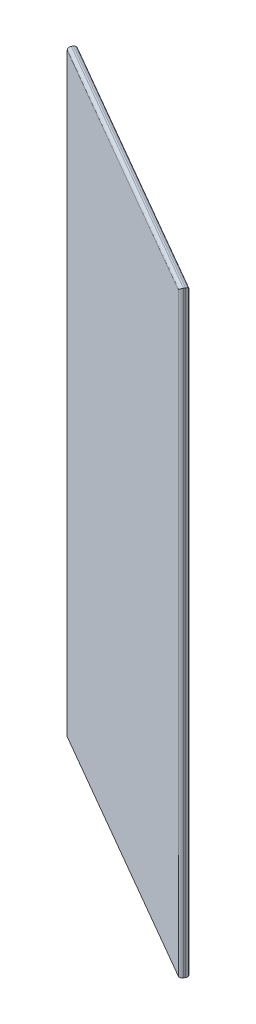
ISO-10303-21;
HEADER;
FILE_DESCRIPTION(('STEP AP214'),'2;1');
FILE_NAME('part.step','',(''),(''),'','','');
FILE_SCHEMA(('AUTOMOTIVE_DESIGN { 1 0 10303 214 1 1 1 1 }'));
ENDSEC;
DATA;
#1=APPLICATION_CONTEXT('core data for automotive mechanical design processes');
#2=APPLICATION_PROTOCOL_DEFINITION('international standard','automotive_design',2000,#1);
#3=PRODUCT_CONTEXT('',#1,'mechanical');
#4=PRODUCT('Part','Part','',(#3));
#5=PRODUCT_RELATED_PRODUCT_CATEGORY('part','',(#4));
#6=PRODUCT_DEFINITION_FORMATION('','',#4);
#7=PRODUCT_DEFINITION_CONTEXT('part definition',#1,'design');
#8=PRODUCT_DEFINITION('design','',#6,#7);
#9=PRODUCT_DEFINITION_SHAPE('','',#8);
#10=(LENGTH_UNIT() NAMED_UNIT(*) SI_UNIT(.MILLI.,.METRE.));
#11=(NAMED_UNIT(*) PLANE_ANGLE_UNIT() SI_UNIT($,.RADIAN.));
#12=(NAMED_UNIT(*) SI_UNIT($,.STERADIAN.) SOLID_ANGLE_UNIT());
#13=UNCERTAINTY_MEASURE_WITH_UNIT(LENGTH_MEASURE(1.E-05),#10,'distance_accuracy_value','');
#14=(GEOMETRIC_REPRESENTATION_CONTEXT(3) GLOBAL_UNCERTAINTY_ASSIGNED_CONTEXT((#13)) GLOBAL_UNIT_ASSIGNED_CONTEXT((#10,
#11,#12)) REPRESENTATION_CONTEXT('',''));
#15=CARTESIAN_POINT('',(0.,0.,0.));
#16=DIRECTION('',(0.,0.,1.));
#17=DIRECTION('',(1.,0.,0.));
#18=AXIS2_PLACEMENT_3D('',#15,#16,#17);
#19=CARTESIAN_POINT('',(416.587352604538,-130.530222179374,-111.500239054493));
#20=DIRECTION('',(-0.500000000000004,0.,0.866025403784437));
#21=DIRECTION('',(0.,1.,0.));
#22=AXIS2_PLACEMENT_3D('',#19,#20,#21);
#23=PLANE('',#22);
#24=DIRECTION('',(0.,1.,0.));
#25=VECTOR('',#24,1.);
#26=CARTESIAN_POINT('',(412.543041450155,-130.530222179374,-113.835223188163));
#27=LINE('',#26,#25);
#28=CARTESIAN_POINT('',(412.543041450155,75.0000000000001,-113.835223188163));
#29=VERTEX_POINT('',#28);
#30=CARTESIAN_POINT('',(412.543041450155,468.,-113.835223188163));
#31=VERTEX_POINT('',#30);
#32=EDGE_CURVE('E140',#29,#31,#27,.T.);
#33=ORIENTED_EDGE('',*,*,#32,.T.);
#34=DIRECTION('',(0.866025403784437,0.,0.500000000000004));
#35=VECTOR('',#34,1.);
#36=CARTESIAN_POINT('',(416.587352604538,468.,-111.500239054493));
#37=LINE('',#36,#35);
#38=CARTESIAN_POINT('',(238.645636945092,468.,-214.234936490539));
#39=VERTEX_POINT('',#38);
#40=EDGE_CURVE('E142',#31,#39,#37,.F.);
#41=ORIENTED_EDGE('',*,*,#40,.T.);
#42=DIRECTION('',(0.,1.,0.));
#43=VECTOR('',#42,1.);
#44=CARTESIAN_POINT('',(238.645636945092,-130.530222179374,-214.234936490539));
#45=LINE('',#44,#43);
#46=CARTESIAN_POINT('',(238.645636945092,75.,-214.234936490539));
#47=VERTEX_POINT('',#46);
#48=EDGE_CURVE('E115',#47,#39,#45,.T.);
#49=ORIENTED_EDGE('',*,*,#48,.F.);
#50=DIRECTION('',(-0.866025403784437,0.,-0.500000000000004));
#51=VECTOR('',#50,1.);
#52=CARTESIAN_POINT('',(416.587352604538,75.0000000000001,-111.500239054493));
#53=LINE('',#52,#51);
#54=EDGE_CURVE('E107',#29,#47,#53,.T.);
#55=ORIENTED_EDGE('',*,*,#54,.F.);
#56=EDGE_LOOP('',(#33,#41,#49,#55));
#57=FACE_BOUND('',#56,.T.);
#58=ADVANCED_FACE('F38',(#57),#23,.T.);
#59=CARTESIAN_POINT('',(419.087352604538,-130.530222179374,-115.830366073415));
#60=DIRECTION('',(0.500000000000004,0.,-0.866025403784437));
#61=DIRECTION('',(0.,-1.,0.));
#62=AXIS2_PLACEMENT_3D('',#59,#60,#61);
#63=PLANE('',#62);
#64=DIRECTION('',(0.,1.,0.));
#65=VECTOR('',#64,1.);
#66=CARTESIAN_POINT('',(241.145636945092,-130.530222179374,-218.565063509461));
#67=LINE('',#66,#65);
#68=CARTESIAN_POINT('',(241.145636945092,75.,-218.565063509461));
#69=VERTEX_POINT('',#68);
#70=CARTESIAN_POINT('',(241.145636945092,468.,-218.565063509461));
#71=VERTEX_POINT('',#70);
#72=EDGE_CURVE('E114',#69,#71,#67,.T.);
#73=ORIENTED_EDGE('',*,*,#72,.T.);
#74=DIRECTION('',(-0.866025403784437,0.,-0.500000000000004));
#75=VECTOR('',#74,1.);
#76=CARTESIAN_POINT('',(419.087352604538,468.,-115.830366073415));
#77=LINE('',#76,#75);
#78=CARTESIAN_POINT('',(415.043041450155,468.,-118.165350207085));
#79=VERTEX_POINT('',#78);
#80=EDGE_CURVE('E11',#71,#79,#77,.F.);
#81=ORIENTED_EDGE('',*,*,#80,.T.);
#82=DIRECTION('',(0.,1.,0.));
#83=VECTOR('',#82,1.);
#84=CARTESIAN_POINT('',(415.043041450155,-130.530222179374,-118.165350207085));
#85=LINE('',#84,#83);
#86=CARTESIAN_POINT('',(415.043041450155,75.0000000000001,-118.165350207085));
#87=VERTEX_POINT('',#86);
#88=EDGE_CURVE('E47',#79,#87,#85,.F.);
#89=ORIENTED_EDGE('',*,*,#88,.T.);
#90=DIRECTION('',(0.866025403784437,0.,0.500000000000004));
#91=VECTOR('',#90,1.);
#92=CARTESIAN_POINT('',(419.087352604538,75.0000000000001,-115.830366073415));
#93=LINE('',#92,#91);
#94=EDGE_CURVE('E104',#69,#87,#93,.T.);
#95=ORIENTED_EDGE('',*,*,#94,.F.);
#96=EDGE_LOOP('',(#73,#81,#89,#95));
#97=FACE_BOUND('',#96,.T.);
#98=ADVANCED_FACE('F113',(#97),#63,.T.);
#99=CARTESIAN_POINT('',(142.644284148503,470.,-532.355715851499));
#100=DIRECTION('',(0.,1.,0.));
#101=DIRECTION('',(-0.866025403784436,0.,-0.500000000000004));
#102=AXIS2_PLACEMENT_3D('',#99,#100,#101);
#103=PLANE('',#102);
#104=DIRECTION('',(-0.500000000000004,0.,0.866025403784436));
#105=VECTOR('',#104,1.);
#106=CARTESIAN_POINT('',(241.145636945092,470.,-218.565063509461));
#107=LINE('',#106,#105);
#108=CARTESIAN_POINT('',(240.145636945092,470.,-216.833012701892));
#109=VERTEX_POINT('',#108);
#110=CARTESIAN_POINT('',(239.645636945092,470.,-215.966987298108));
#111=VERTEX_POINT('',#110);
#112=EDGE_CURVE('E120',#109,#111,#107,.T.);
#113=ORIENTED_EDGE('',*,*,#112,.T.);
#114=DIRECTION('',(0.866025403784437,0.,0.500000000000004));
#115=VECTOR('',#114,1.);
#116=CARTESIAN_POINT('',(29.8942841485017,470.,-337.066987298109));
#117=LINE('',#116,#115);
#118=CARTESIAN_POINT('',(415.275096772052,470.,-114.567271389383));
#119=VERTEX_POINT('',#118);
#120=EDGE_CURVE('E133',#111,#119,#117,.T.);
#121=ORIENTED_EDGE('',*,*,#120,.T.);
#122=CARTESIAN_POINT('',(225.,470.,-225.));
#123=DIRECTION('',(0.,1.,0.));
#124=DIRECTION('',(0.500000000000004,0.,-0.866025403784436));
#125=AXIS2_PLACEMENT_3D('',#122,#123,#124);
#126=CIRCLE('',#125,220.);
#127=CARTESIAN_POINT('',(415.775096772052,470.,-115.433296793167));
#128=VERTEX_POINT('',#127);
#129=EDGE_CURVE('E158',#119,#128,#126,.T.);
#130=ORIENTED_EDGE('',*,*,#129,.T.);
#131=DIRECTION('',(-0.866025403784437,0.,-0.500000000000004));
#132=VECTOR('',#131,1.);
#133=CARTESIAN_POINT('',(30.3942841485018,470.,-337.933012701893));
#134=LINE('',#133,#132);
#135=EDGE_CURVE('E130',#128,#109,#134,.T.);
#136=ORIENTED_EDGE('',*,*,#135,.T.);
#137=EDGE_LOOP('',(#113,#121,#130,#136));
#138=FACE_BOUND('',#137,.T.);
#139=ADVANCED_FACE('F182',(#138),#103,.T.);
#140=CARTESIAN_POINT('',(225.,75.,-225.));
#141=DIRECTION('',(0.,1.,0.));
#142=DIRECTION('',(0.500000000000004,0.,-0.866025403784436));
#143=AXIS2_PLACEMENT_3D('',#140,#141,#142);
#144=PLANE('',#143);
#145=CARTESIAN_POINT('',(225.,75.,-225.));
#146=DIRECTION('',(0.,1.,0.));
#147=DIRECTION('',(0.500000000000004,0.,-0.866025403784436));
#148=AXIS2_PLACEMENT_3D('',#145,#146,#147);
#149=CIRCLE('',#148,220.);
#150=CARTESIAN_POINT('',(415.272794124009,75.0000000000001,-114.56330403239));
#151=VERTEX_POINT('',#150);
#152=CARTESIAN_POINT('',(415.777381279973,75.0000000000001,-115.437274623365));
#153=VERTEX_POINT('',#152);
#154=EDGE_CURVE('E127',#151,#153,#149,.T.);
#155=ORIENTED_EDGE('',*,*,#154,.F.);
#156=CARTESIAN_POINT('',(413.543041450155,75.0000000000001,-115.567273995732));
#157=DIRECTION('',(0.,1.,0.));
#158=DIRECTION('',(0.500000000000004,0.,-0.866025403784436));
#159=AXIS2_PLACEMENT_3D('',#156,#157,#158);
#160=CIRCLE('',#159,2.);
#161=EDGE_CURVE('E149',#151,#29,#160,.F.);
#162=ORIENTED_EDGE('',*,*,#161,.T.);
#163=ORIENTED_EDGE('',*,*,#54,.T.);
#164=DIRECTION('',(0.500000000000004,0.,-0.866025403784436));
#165=VECTOR('',#164,1.);
#166=CARTESIAN_POINT('',(241.145636945092,75.,-218.565063509461));
#167=LINE('',#166,#165);
#168=EDGE_CURVE('E101',#47,#69,#167,.T.);
#169=ORIENTED_EDGE('',*,*,#168,.T.);
#170=ORIENTED_EDGE('',*,*,#94,.T.);
#171=CARTESIAN_POINT('',(414.043041450155,75.0000000000001,-116.433299399516));
#172=DIRECTION('',(0.,1.,0.));
#173=DIRECTION('',(0.500000000000004,0.,-0.866025403784436));
#174=AXIS2_PLACEMENT_3D('',#171,#172,#173);
#175=CIRCLE('',#174,2.);
#176=EDGE_CURVE('E147',#87,#153,#175,.F.);
#177=ORIENTED_EDGE('',*,*,#176,.T.);
#178=EDGE_LOOP('',(#155,#162,#163,#169,#170,#177));
#179=FACE_BOUND('',#178,.T.);
#180=ADVANCED_FACE('F103',(#179),#144,.F.);
#181=CARTESIAN_POINT('',(241.145636945092,-130.530222179374,-218.565063509461));
#182=DIRECTION('',(-0.866025403784436,0.,-0.500000000000004));
#183=DIRECTION('',(0.,-1.,0.));
#184=AXIS2_PLACEMENT_3D('',#181,#182,#183);
#185=PLANE('',#184);
#186=ORIENTED_EDGE('',*,*,#48,.T.);
#187=CARTESIAN_POINT('',(239.645636945092,468.,-215.966987298108));
#188=DIRECTION('',(-0.866025403784436,0.,-0.500000000000004));
#189=DIRECTION('',(0.,-1.,0.));
#190=AXIS2_PLACEMENT_3D('',#187,#188,#189);
#191=CIRCLE('',#190,2.);
#192=EDGE_CURVE('E145',#39,#111,#191,.T.);
#193=ORIENTED_EDGE('',*,*,#192,.T.);
#194=ORIENTED_EDGE('',*,*,#112,.F.);
#195=CARTESIAN_POINT('',(240.145636945092,468.,-216.833012701892));
#196=DIRECTION('',(-0.866025403784436,0.,-0.500000000000004));
#197=DIRECTION('',(0.,-1.,0.));
#198=AXIS2_PLACEMENT_3D('',#195,#196,#197);
#199=CIRCLE('',#198,2.);
#200=EDGE_CURVE('E119',#109,#71,#199,.T.);
#201=ORIENTED_EDGE('',*,*,#200,.T.);
#202=ORIENTED_EDGE('',*,*,#72,.F.);
#203=ORIENTED_EDGE('',*,*,#168,.F.);
#204=EDGE_LOOP('',(#186,#193,#194,#201,#202,#203));
#205=FACE_BOUND('',#204,.T.);
#206=ADVANCED_FACE('F117',(#205),#185,.T.);
#207=CARTESIAN_POINT('',(225.,-606.32717805851,-225.));
#208=DIRECTION('',(0.,1.,0.));
#209=DIRECTION('',(0.500000000000004,0.,-0.866025403784436));
#210=AXIS2_PLACEMENT_3D('',#207,#208,#209);
#211=CYLINDRICAL_SURFACE('',#210,220.);
#212=CARTESIAN_POINT('',(415.272794124009,470.,-114.56330403239));
#213=VERTEX_POINT('',#212);
#214=EDGE_CURVE('E124',#213,#119,#126,.T.);
#215=ORIENTED_EDGE('',*,*,#214,.F.);
#216=DIRECTION('',(0.,1.,0.));
#217=VECTOR('',#216,1.);
#218=CARTESIAN_POINT('',(415.272794124009,-606.327178058509,-114.56330403239));
#219=LINE('',#218,#217);
#220=EDGE_CURVE('E138',#213,#151,#219,.F.);
#221=ORIENTED_EDGE('',*,*,#220,.T.);
#222=ORIENTED_EDGE('',*,*,#154,.T.);
#223=DIRECTION('',(0.,1.,0.));
#224=VECTOR('',#223,1.);
#225=CARTESIAN_POINT('',(415.777381279973,-606.327178058509,-115.437274623365));
#226=LINE('',#225,#224);
#227=CARTESIAN_POINT('',(415.777381279973,470.,-115.437274623365));
#228=VERTEX_POINT('',#227);
#229=EDGE_CURVE('E136',#153,#228,#226,.T.);
#230=ORIENTED_EDGE('',*,*,#229,.T.);
#231=EDGE_CURVE('E153',#128,#228,#126,.T.);
#232=ORIENTED_EDGE('',*,*,#231,.F.);
#233=ORIENTED_EDGE('',*,*,#129,.F.);
#234=EDGE_LOOP('',(#215,#221,#222,#230,#232,#233));
#235=FACE_BOUND('',#234,.T.);
#236=ADVANCED_FACE('F169',(#235),#211,.T.);
#237=CARTESIAN_POINT('',(413.543041450155,-606.327178058509,-115.567273995731));
#238=DIRECTION('',(0.,1.,0.));
#239=DIRECTION('',(0.500000000000004,0.,-0.866025403784436));
#240=AXIS2_PLACEMENT_3D('',#237,#238,#239);
#241=CYLINDRICAL_SURFACE('',#240,2.);
#242=ORIENTED_EDGE('',*,*,#161,.F.);
#243=ORIENTED_EDGE('',*,*,#220,.F.);
#244=CARTESIAN_POINT('',(413.543041450155,468.,-115.567273995732));
#245=DIRECTION('',(-0.612372435695793,0.707106781186547,-0.353553390593277));
#246=DIRECTION('',(0.612372435695793,0.707106781186548,0.353553390593276));
#247=AXIS2_PLACEMENT_3D('',#244,#245,#246);
#248=ELLIPSE('',#247,2.82842712474619,2.);
#249=EDGE_CURVE('E151',#31,#213,#248,.T.);
#250=ORIENTED_EDGE('',*,*,#249,.F.);
#251=ORIENTED_EDGE('',*,*,#32,.F.);
#252=EDGE_LOOP('',(#242,#243,#250,#251));
#253=FACE_BOUND('',#252,.T.);
#254=ADVANCED_FACE('F173',(#253),#241,.T.);
#255=CARTESIAN_POINT('',(29.8942841485017,468.,-337.066987298109));
#256=DIRECTION('',(0.866025403784437,0.,0.500000000000004));
#257=DIRECTION('',(0.,1.,0.));
#258=AXIS2_PLACEMENT_3D('',#255,#256,#257);
#259=CYLINDRICAL_SURFACE('',#258,2.);
#260=ORIENTED_EDGE('',*,*,#192,.F.);
#261=ORIENTED_EDGE('',*,*,#40,.F.);
#262=ORIENTED_EDGE('',*,*,#249,.T.);
#263=ORIENTED_EDGE('',*,*,#214,.T.);
#264=ORIENTED_EDGE('',*,*,#120,.F.);
#265=EDGE_LOOP('',(#260,#261,#262,#263,#264));
#266=FACE_BOUND('',#265,.T.);
#267=ADVANCED_FACE('F179',(#266),#259,.T.);
#268=CARTESIAN_POINT('',(414.043041450155,-606.327178058509,-116.433299399516));
#269=DIRECTION('',(0.,1.,0.));
#270=DIRECTION('',(0.500000000000004,0.,-0.866025403784436));
#271=AXIS2_PLACEMENT_3D('',#268,#269,#270);
#272=CYLINDRICAL_SURFACE('',#271,2.);
#273=ORIENTED_EDGE('',*,*,#176,.F.);
#274=ORIENTED_EDGE('',*,*,#88,.F.);
#275=CARTESIAN_POINT('',(414.043041450155,468.,-116.433299399516));
#276=DIRECTION('',(-0.612372435695793,0.707106781186547,-0.353553390593277));
#277=DIRECTION('',(0.612372435695793,0.707106781186548,0.353553390593276));
#278=AXIS2_PLACEMENT_3D('',#275,#276,#277);
#279=ELLIPSE('',#278,2.82842712474619,2.);
#280=EDGE_CURVE('E42',#228,#79,#279,.T.);
#281=ORIENTED_EDGE('',*,*,#280,.F.);
#282=ORIENTED_EDGE('',*,*,#229,.F.);
#283=EDGE_LOOP('',(#273,#274,#281,#282));
#284=FACE_BOUND('',#283,.T.);
#285=ADVANCED_FACE('F40',(#284),#272,.T.);
#286=CARTESIAN_POINT('',(30.3942841485018,468.,-337.933012701893));
#287=DIRECTION('',(-0.866025403784437,0.,-0.500000000000004));
#288=DIRECTION('',(0.,-1.,0.));
#289=AXIS2_PLACEMENT_3D('',#286,#287,#288);
#290=CYLINDRICAL_SURFACE('',#289,2.);
#291=ORIENTED_EDGE('',*,*,#280,.T.);
#292=ORIENTED_EDGE('',*,*,#80,.F.);
#293=ORIENTED_EDGE('',*,*,#200,.F.);
#294=ORIENTED_EDGE('',*,*,#135,.F.);
#295=ORIENTED_EDGE('',*,*,#231,.T.);
#296=EDGE_LOOP('',(#291,#292,#293,#294,#295));
#297=FACE_BOUND('',#296,.T.);
#298=ADVANCED_FACE('F163',(#297),#290,.T.);
#299=CLOSED_SHELL('',(#58,#98,#139,#180,#206,#236,#254,#267,#285,#298));
#300=MANIFOLD_SOLID_BREP('B2',#299);
#301=ADVANCED_BREP_SHAPE_REPRESENTATION('',(#18,#300),#14);
#302=SHAPE_DEFINITION_REPRESENTATION(#9,#301);
ENDSEC;
END-ISO-10303-21;
